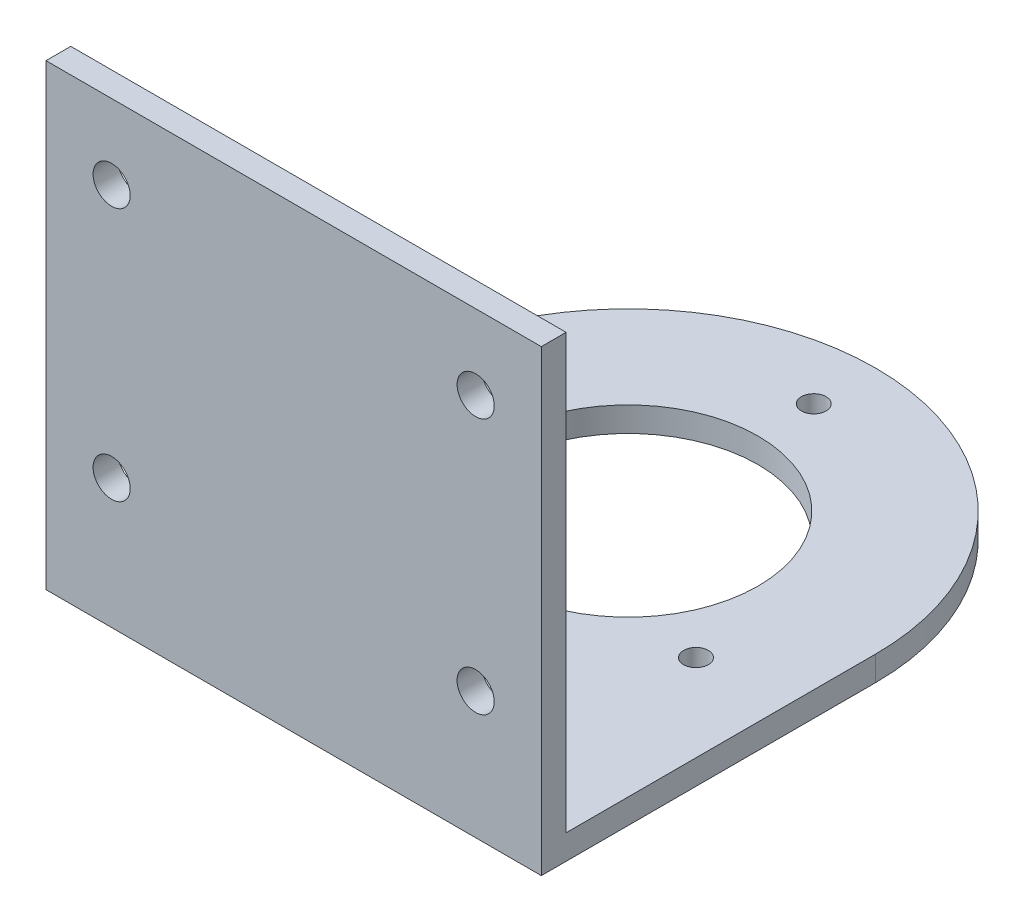
ISO-10303-21;
HEADER;
FILE_DESCRIPTION(('STEP AP214'),'2;1');
FILE_NAME('part.step','',(''),(''),'','','');
FILE_SCHEMA(('AUTOMOTIVE_DESIGN { 1 0 10303 214 1 1 1 1 }'));
ENDSEC;
DATA;
#1=APPLICATION_CONTEXT('core data for automotive mechanical design processes');
#2=APPLICATION_PROTOCOL_DEFINITION('international standard','automotive_design',2000,#1);
#3=PRODUCT_CONTEXT('',#1,'mechanical');
#4=PRODUCT('Part','Part','',(#3));
#5=PRODUCT_RELATED_PRODUCT_CATEGORY('part','',(#4));
#6=PRODUCT_DEFINITION_FORMATION('','',#4);
#7=PRODUCT_DEFINITION_CONTEXT('part definition',#1,'design');
#8=PRODUCT_DEFINITION('design','',#6,#7);
#9=PRODUCT_DEFINITION_SHAPE('','',#8);
#10=(LENGTH_UNIT() NAMED_UNIT(*) SI_UNIT(.MILLI.,.METRE.));
#11=(NAMED_UNIT(*) PLANE_ANGLE_UNIT() SI_UNIT($,.RADIAN.));
#12=(NAMED_UNIT(*) SI_UNIT($,.STERADIAN.) SOLID_ANGLE_UNIT());
#13=UNCERTAINTY_MEASURE_WITH_UNIT(LENGTH_MEASURE(1.E-05),#10,'distance_accuracy_value','');
#14=(GEOMETRIC_REPRESENTATION_CONTEXT(3) GLOBAL_UNCERTAINTY_ASSIGNED_CONTEXT((#13)) GLOBAL_UNIT_ASSIGNED_CONTEXT((#10,
#11,#12)) REPRESENTATION_CONTEXT('',''));
#15=CARTESIAN_POINT('',(0.,0.,0.));
#16=DIRECTION('',(0.,0.,1.));
#17=DIRECTION('',(1.,0.,0.));
#18=AXIS2_PLACEMENT_3D('',#15,#16,#17);
#19=CARTESIAN_POINT('',(1.77083333333332,2.,-5.43749999999999));
#20=DIRECTION('',(0.,1.,0.));
#21=DIRECTION('',(0.,0.,1.));
#22=AXIS2_PLACEMENT_3D('',#19,#20,#21);
#23=PLANE('',#22);
#24=CARTESIAN_POINT('',(14.7612143900999,2.,2.06250000000007));
#25=DIRECTION('',(0.,1.,0.));
#26=DIRECTION('',(-0.866025403784436,0.,-0.500000000000004));
#27=AXIS2_PLACEMENT_3D('',#24,#25,#26);
#28=CIRCLE('',#27,1.);
#29=CARTESIAN_POINT('',(13.8951889863154,2.,1.56250000000007));
#30=VERTEX_POINT('',#29);
#31=EDGE_CURVE('E121',#30,#30,#28,.T.);
#32=ORIENTED_EDGE('',*,*,#31,.F.);
#33=EDGE_LOOP('',(#32));
#34=FACE_BOUND('',#33,.T.);
#35=CARTESIAN_POINT('',(-11.2195477234333,2.,2.06249999999989));
#36=DIRECTION('',(0.,1.,0.));
#37=DIRECTION('',(0.866025403784443,0.,-0.499999999999992));
#38=AXIS2_PLACEMENT_3D('',#35,#36,#37);
#39=CIRCLE('',#38,1.);
#40=CARTESIAN_POINT('',(-10.3535223196489,2.,1.5624999999999));
#41=VERTEX_POINT('',#40);
#42=EDGE_CURVE('E126',#41,#41,#39,.T.);
#43=ORIENTED_EDGE('',*,*,#42,.F.);
#44=EDGE_LOOP('',(#43));
#45=FACE_BOUND('',#44,.T.);
#46=CARTESIAN_POINT('',(1.77083333333332,2.,-20.4375));
#47=DIRECTION('',(0.,1.,0.));
#48=DIRECTION('',(0.,0.,1.));
#49=AXIS2_PLACEMENT_3D('',#46,#47,#48);
#50=CIRCLE('',#49,1.);
#51=CARTESIAN_POINT('',(1.77083333333332,2.,-19.4375));
#52=VERTEX_POINT('',#51);
#53=EDGE_CURVE('E118',#52,#52,#50,.T.);
#54=ORIENTED_EDGE('',*,*,#53,.F.);
#55=EDGE_LOOP('',(#54));
#56=FACE_BOUND('',#55,.T.);
#57=DIRECTION('',(-1.,0.,0.));
#58=VECTOR('',#57,1.);
#59=CARTESIAN_POINT('',(-18.2291666666667,2.,19.5625));
#60=LINE('',#59,#58);
#61=CARTESIAN_POINT('',(21.7708333333333,2.,19.5625));
#62=VERTEX_POINT('',#61);
#63=CARTESIAN_POINT('',(-18.2291666666667,2.,19.5625));
#64=VERTEX_POINT('',#63);
#65=EDGE_CURVE('E56',#62,#64,#60,.T.);
#66=ORIENTED_EDGE('',*,*,#65,.F.);
#67=DIRECTION('',(0.,0.,-1.));
#68=VECTOR('',#67,1.);
#69=CARTESIAN_POINT('',(21.7708333333333,2.,-5.43749999999999));
#70=LINE('',#69,#68);
#71=CARTESIAN_POINT('',(21.7708333333333,2.,-5.43749999999999));
#72=VERTEX_POINT('',#71);
#73=EDGE_CURVE('E61',#62,#72,#70,.T.);
#74=ORIENTED_EDGE('',*,*,#73,.T.);
#75=CARTESIAN_POINT('',(1.77083333333332,2.,-5.43749999999999));
#76=DIRECTION('',(0.,1.,0.));
#77=DIRECTION('',(0.,0.,1.));
#78=AXIS2_PLACEMENT_3D('',#75,#76,#77);
#79=CIRCLE('',#78,20.);
#80=CARTESIAN_POINT('',(-18.2291666666667,2.,-5.43749999999999));
#81=VERTEX_POINT('',#80);
#82=EDGE_CURVE('E92',#72,#81,#79,.T.);
#83=ORIENTED_EDGE('',*,*,#82,.T.);
#84=DIRECTION('',(0.,0.,1.));
#85=VECTOR('',#84,1.);
#86=CARTESIAN_POINT('',(-18.2291666666667,2.,-5.43749999999999));
#87=LINE('',#86,#85);
#88=EDGE_CURVE('E159',#81,#64,#87,.T.);
#89=ORIENTED_EDGE('',*,*,#88,.T.);
#90=EDGE_LOOP('',(#66,#74,#83,#89));
#91=FACE_BOUND('',#90,.T.);
#92=CARTESIAN_POINT('',(1.77083333333332,2.,-5.43749999999999));
#93=DIRECTION('',(0.,1.,0.));
#94=DIRECTION('',(0.,0.,1.));
#95=AXIS2_PLACEMENT_3D('',#92,#93,#94);
#96=CIRCLE('',#95,10.5);
#97=CARTESIAN_POINT('',(1.77083333333332,2.,5.06250000000001));
#98=VERTEX_POINT('',#97);
#99=EDGE_CURVE('E103',#98,#98,#96,.T.);
#100=ORIENTED_EDGE('',*,*,#99,.F.);
#101=EDGE_LOOP('',(#100));
#102=FACE_BOUND('',#101,.T.);
#103=ADVANCED_FACE('F39',(#34,#45,#56,#91,#102),#23,.T.);
#104=CARTESIAN_POINT('',(1.77083333333332,0.,-5.43749999999999));
#105=DIRECTION('',(0.,1.,0.));
#106=DIRECTION('',(0.,0.,1.));
#107=AXIS2_PLACEMENT_3D('',#104,#105,#106);
#108=PLANE('',#107);
#109=CARTESIAN_POINT('',(14.7612143900999,0.,2.06250000000007));
#110=DIRECTION('',(0.,1.,0.));
#111=DIRECTION('',(0.,0.,1.));
#112=AXIS2_PLACEMENT_3D('',#109,#110,#111);
#113=CIRCLE('',#112,1.);
#114=CARTESIAN_POINT('',(14.7612143900999,0.,3.06250000000007));
#115=VERTEX_POINT('',#114);
#116=EDGE_CURVE('E43',#115,#115,#113,.T.);
#117=ORIENTED_EDGE('',*,*,#116,.T.);
#118=EDGE_LOOP('',(#117));
#119=FACE_BOUND('',#118,.T.);
#120=CARTESIAN_POINT('',(-11.2195477234333,0.,2.06249999999989));
#121=DIRECTION('',(0.,1.,0.));
#122=DIRECTION('',(0.,0.,1.));
#123=AXIS2_PLACEMENT_3D('',#120,#121,#122);
#124=CIRCLE('',#123,1.);
#125=CARTESIAN_POINT('',(-11.2195477234333,0.,3.06249999999989));
#126=VERTEX_POINT('',#125);
#127=EDGE_CURVE('E119',#126,#126,#124,.T.);
#128=ORIENTED_EDGE('',*,*,#127,.T.);
#129=EDGE_LOOP('',(#128));
#130=FACE_BOUND('',#129,.T.);
#131=CARTESIAN_POINT('',(1.77083333333332,0.,-20.4375));
#132=DIRECTION('',(0.,1.,0.));
#133=DIRECTION('',(0.,0.,1.));
#134=AXIS2_PLACEMENT_3D('',#131,#132,#133);
#135=CIRCLE('',#134,1.);
#136=CARTESIAN_POINT('',(1.77083333333332,0.,-19.4375));
#137=VERTEX_POINT('',#136);
#138=EDGE_CURVE('E116',#137,#137,#135,.T.);
#139=ORIENTED_EDGE('',*,*,#138,.T.);
#140=EDGE_LOOP('',(#139));
#141=FACE_BOUND('',#140,.T.);
#142=CARTESIAN_POINT('',(1.77083333333332,0.,-5.43749999999999));
#143=DIRECTION('',(0.,1.,0.));
#144=DIRECTION('',(0.,0.,1.));
#145=AXIS2_PLACEMENT_3D('',#142,#143,#144);
#146=CIRCLE('',#145,20.);
#147=CARTESIAN_POINT('',(21.7708333333333,0.,-5.43749999999999));
#148=VERTEX_POINT('',#147);
#149=CARTESIAN_POINT('',(-18.2291666666667,0.,-5.43749999999999));
#150=VERTEX_POINT('',#149);
#151=EDGE_CURVE('E98',#148,#150,#146,.T.);
#152=ORIENTED_EDGE('',*,*,#151,.F.);
#153=DIRECTION('',(0.,0.,-1.));
#154=VECTOR('',#153,1.);
#155=CARTESIAN_POINT('',(21.7708333333333,0.,-5.43749999999999));
#156=LINE('',#155,#154);
#157=CARTESIAN_POINT('',(21.7708333333333,0.,21.5625));
#158=VERTEX_POINT('',#157);
#159=EDGE_CURVE('E81',#158,#148,#156,.T.);
#160=ORIENTED_EDGE('',*,*,#159,.F.);
#161=DIRECTION('',(1.,0.,0.));
#162=VECTOR('',#161,1.);
#163=CARTESIAN_POINT('',(-18.2291666666667,0.,21.5625));
#164=LINE('',#163,#162);
#165=CARTESIAN_POINT('',(-18.2291666666667,0.,21.5625));
#166=VERTEX_POINT('',#165);
#167=EDGE_CURVE('E93',#166,#158,#164,.T.);
#168=ORIENTED_EDGE('',*,*,#167,.F.);
#169=DIRECTION('',(0.,0.,1.));
#170=VECTOR('',#169,1.);
#171=CARTESIAN_POINT('',(-18.2291666666667,0.,-5.43749999999999));
#172=LINE('',#171,#170);
#173=EDGE_CURVE('E102',#150,#166,#172,.T.);
#174=ORIENTED_EDGE('',*,*,#173,.F.);
#175=EDGE_LOOP('',(#152,#160,#168,#174));
#176=FACE_BOUND('',#175,.T.);
#177=CARTESIAN_POINT('',(1.77083333333332,0.,-5.43749999999999));
#178=DIRECTION('',(0.,1.,0.));
#179=DIRECTION('',(0.,0.,1.));
#180=AXIS2_PLACEMENT_3D('',#177,#178,#179);
#181=CIRCLE('',#180,10.5);
#182=CARTESIAN_POINT('',(1.77083333333332,0.,5.06250000000001));
#183=VERTEX_POINT('',#182);
#184=EDGE_CURVE('E107',#183,#183,#181,.T.);
#185=ORIENTED_EDGE('',*,*,#184,.T.);
#186=EDGE_LOOP('',(#185));
#187=FACE_BOUND('',#186,.T.);
#188=ADVANCED_FACE('F100',(#119,#130,#141,#176,#187),#108,.F.);
#189=CARTESIAN_POINT('',(1.77083333333332,2.,-5.43749999999999));
#190=DIRECTION('',(0.,-1.,0.));
#191=DIRECTION('',(0.,0.,-1.));
#192=AXIS2_PLACEMENT_3D('',#189,#190,#191);
#193=CYLINDRICAL_SURFACE('',#192,20.);
#194=ORIENTED_EDGE('',*,*,#151,.T.);
#195=DIRECTION('',(0.,-1.,0.));
#196=VECTOR('',#195,1.);
#197=CARTESIAN_POINT('',(-18.2291666666667,2.,-5.43749999999999));
#198=LINE('',#197,#196);
#199=EDGE_CURVE('E11',#81,#150,#198,.T.);
#200=ORIENTED_EDGE('',*,*,#199,.F.);
#201=ORIENTED_EDGE('',*,*,#82,.F.);
#202=DIRECTION('',(0.,-1.,0.));
#203=VECTOR('',#202,1.);
#204=CARTESIAN_POINT('',(21.7708333333333,2.,-5.43749999999999));
#205=LINE('',#204,#203);
#206=EDGE_CURVE('E84',#72,#148,#205,.T.);
#207=ORIENTED_EDGE('',*,*,#206,.T.);
#208=EDGE_LOOP('',(#194,#200,#201,#207));
#209=FACE_BOUND('',#208,.T.);
#210=ADVANCED_FACE('F41',(#209),#193,.T.);
#211=CARTESIAN_POINT('',(-18.2291666666667,2.,-5.43749999999999));
#212=DIRECTION('',(1.,0.,0.));
#213=DIRECTION('',(0.,0.,-1.));
#214=AXIS2_PLACEMENT_3D('',#211,#212,#213);
#215=PLANE('',#214);
#216=ORIENTED_EDGE('',*,*,#173,.T.);
#217=DIRECTION('',(0.,-1.,0.));
#218=VECTOR('',#217,1.);
#219=CARTESIAN_POINT('',(-18.2291666666667,2.,21.5625));
#220=LINE('',#219,#218);
#221=CARTESIAN_POINT('',(-18.2291666666667,37.,21.5625));
#222=VERTEX_POINT('',#221);
#223=EDGE_CURVE('E48',#222,#166,#220,.T.);
#224=ORIENTED_EDGE('',*,*,#223,.F.);
#225=DIRECTION('',(0.,0.,1.));
#226=VECTOR('',#225,1.);
#227=CARTESIAN_POINT('',(-18.2291666666667,37.,21.5625));
#228=LINE('',#227,#226);
#229=CARTESIAN_POINT('',(-18.2291666666667,37.,19.5625));
#230=VERTEX_POINT('',#229);
#231=EDGE_CURVE('E138',#230,#222,#228,.T.);
#232=ORIENTED_EDGE('',*,*,#231,.F.);
#233=DIRECTION('',(0.,-1.,0.));
#234=VECTOR('',#233,1.);
#235=CARTESIAN_POINT('',(-18.2291666666667,37.,19.5625));
#236=LINE('',#235,#234);
#237=EDGE_CURVE('E150',#230,#64,#236,.T.);
#238=ORIENTED_EDGE('',*,*,#237,.T.);
#239=ORIENTED_EDGE('',*,*,#88,.F.);
#240=ORIENTED_EDGE('',*,*,#199,.T.);
#241=EDGE_LOOP('',(#216,#224,#232,#238,#239,#240));
#242=FACE_BOUND('',#241,.T.);
#243=ADVANCED_FACE('F170',(#242),#215,.F.);
#244=CARTESIAN_POINT('',(-18.2291666666667,2.,21.5625));
#245=DIRECTION('',(0.,0.,-1.));
#246=DIRECTION('',(-1.,0.,0.));
#247=AXIS2_PLACEMENT_3D('',#244,#245,#246);
#248=PLANE('',#247);
#249=CARTESIAN_POINT('',(-12.9291666666667,30.9641670200774,21.5625));
#250=DIRECTION('',(0.,0.,-1.));
#251=DIRECTION('',(-1.,0.,0.));
#252=AXIS2_PLACEMENT_3D('',#249,#250,#251);
#253=CIRCLE('',#252,1.5);
#254=CARTESIAN_POINT('',(-14.4291666666667,30.9641670200774,21.5625));
#255=VERTEX_POINT('',#254);
#256=EDGE_CURVE('E245',#255,#255,#253,.T.);
#257=ORIENTED_EDGE('',*,*,#256,.T.);
#258=EDGE_LOOP('',(#257));
#259=FACE_BOUND('',#258,.T.);
#260=CARTESIAN_POINT('',(-12.9291666666667,10.4708516025523,21.5625));
#261=DIRECTION('',(0.,0.,-1.));
#262=DIRECTION('',(-1.,0.,0.));
#263=AXIS2_PLACEMENT_3D('',#260,#261,#262);
#264=CIRCLE('',#263,1.5);
#265=CARTESIAN_POINT('',(-14.4291666666667,10.4708516025523,21.5625));
#266=VERTEX_POINT('',#265);
#267=EDGE_CURVE('E247',#266,#266,#264,.T.);
#268=ORIENTED_EDGE('',*,*,#267,.T.);
#269=EDGE_LOOP('',(#268));
#270=FACE_BOUND('',#269,.T.);
#271=CARTESIAN_POINT('',(16.4668883487892,10.2623719123833,21.5625));
#272=DIRECTION('',(0.,0.,-1.));
#273=DIRECTION('',(-1.,0.,0.));
#274=AXIS2_PLACEMENT_3D('',#271,#272,#273);
#275=CIRCLE('',#274,1.5);
#276=CARTESIAN_POINT('',(14.9668883487892,10.2623719123833,21.5625));
#277=VERTEX_POINT('',#276);
#278=EDGE_CURVE('E131',#277,#277,#275,.T.);
#279=ORIENTED_EDGE('',*,*,#278,.T.);
#280=EDGE_LOOP('',(#279));
#281=FACE_BOUND('',#280,.T.);
#282=CARTESIAN_POINT('',(16.4708333333333,30.9524700707891,21.5625));
#283=DIRECTION('',(0.,0.,-1.));
#284=DIRECTION('',(-1.,0.,0.));
#285=AXIS2_PLACEMENT_3D('',#282,#283,#284);
#286=CIRCLE('',#285,1.5);
#287=CARTESIAN_POINT('',(14.9708333333333,30.9524700707891,21.5625));
#288=VERTEX_POINT('',#287);
#289=EDGE_CURVE('E257',#288,#288,#286,.T.);
#290=ORIENTED_EDGE('',*,*,#289,.T.);
#291=EDGE_LOOP('',(#290));
#292=FACE_BOUND('',#291,.T.);
#293=ORIENTED_EDGE('',*,*,#167,.T.);
#294=DIRECTION('',(0.,-1.,0.));
#295=VECTOR('',#294,1.);
#296=CARTESIAN_POINT('',(21.7708333333333,2.,21.5625));
#297=LINE('',#296,#295);
#298=CARTESIAN_POINT('',(21.7708333333333,37.,21.5625));
#299=VERTEX_POINT('',#298);
#300=EDGE_CURVE('E88',#299,#158,#297,.T.);
#301=ORIENTED_EDGE('',*,*,#300,.F.);
#302=DIRECTION('',(1.,0.,0.));
#303=VECTOR('',#302,1.);
#304=CARTESIAN_POINT('',(-18.2291666666667,37.,21.5625));
#305=LINE('',#304,#303);
#306=EDGE_CURVE('E141',#222,#299,#305,.T.);
#307=ORIENTED_EDGE('',*,*,#306,.F.);
#308=ORIENTED_EDGE('',*,*,#223,.T.);
#309=EDGE_LOOP('',(#293,#301,#307,#308));
#310=FACE_BOUND('',#309,.T.);
#311=ADVANCED_FACE('F182',(#259,#270,#281,#292,#310),#248,.F.);
#312=CARTESIAN_POINT('',(21.7708333333333,2.,-5.43749999999999));
#313=DIRECTION('',(-1.,0.,0.));
#314=DIRECTION('',(0.,0.,1.));
#315=AXIS2_PLACEMENT_3D('',#312,#313,#314);
#316=PLANE('',#315);
#317=ORIENTED_EDGE('',*,*,#159,.T.);
#318=ORIENTED_EDGE('',*,*,#206,.F.);
#319=ORIENTED_EDGE('',*,*,#73,.F.);
#320=DIRECTION('',(0.,-1.,0.));
#321=VECTOR('',#320,1.);
#322=CARTESIAN_POINT('',(21.7708333333333,37.,19.5625));
#323=LINE('',#322,#321);
#324=CARTESIAN_POINT('',(21.7708333333333,37.,19.5625));
#325=VERTEX_POINT('',#324);
#326=EDGE_CURVE('E154',#325,#62,#323,.T.);
#327=ORIENTED_EDGE('',*,*,#326,.F.);
#328=DIRECTION('',(0.,0.,-1.));
#329=VECTOR('',#328,1.);
#330=CARTESIAN_POINT('',(21.7708333333333,37.,21.5625));
#331=LINE('',#330,#329);
#332=EDGE_CURVE('E144',#299,#325,#331,.T.);
#333=ORIENTED_EDGE('',*,*,#332,.F.);
#334=ORIENTED_EDGE('',*,*,#300,.T.);
#335=EDGE_LOOP('',(#317,#318,#319,#327,#333,#334));
#336=FACE_BOUND('',#335,.T.);
#337=ADVANCED_FACE('F83',(#336),#316,.F.);
#338=CARTESIAN_POINT('',(1.77083333333332,2.,-5.43749999999999));
#339=DIRECTION('',(0.,-1.,0.));
#340=DIRECTION('',(0.,0.,-1.));
#341=AXIS2_PLACEMENT_3D('',#338,#339,#340);
#342=CYLINDRICAL_SURFACE('',#341,10.5);
#343=ORIENTED_EDGE('',*,*,#99,.T.);
#344=EDGE_LOOP('',(#343));
#345=FACE_BOUND('',#344,.T.);
#346=ORIENTED_EDGE('',*,*,#184,.F.);
#347=EDGE_LOOP('',(#346));
#348=FACE_BOUND('',#347,.T.);
#349=ADVANCED_FACE('F190',(#345,#348),#342,.F.);
#350=CARTESIAN_POINT('',(-18.2291666666667,37.,19.5625));
#351=DIRECTION('',(0.,0.,1.));
#352=DIRECTION('',(1.,0.,0.));
#353=AXIS2_PLACEMENT_3D('',#350,#351,#352);
#354=PLANE('',#353);
#355=CARTESIAN_POINT('',(-12.9291666666667,30.9641670200774,19.5625));
#356=DIRECTION('',(0.,0.,-1.));
#357=DIRECTION('',(-1.,0.,0.));
#358=AXIS2_PLACEMENT_3D('',#355,#356,#357);
#359=CIRCLE('',#358,1.5);
#360=CARTESIAN_POINT('',(-14.4291666666667,30.9641670200774,19.5625));
#361=VERTEX_POINT('',#360);
#362=EDGE_CURVE('E243',#361,#361,#359,.T.);
#363=ORIENTED_EDGE('',*,*,#362,.F.);
#364=EDGE_LOOP('',(#363));
#365=FACE_BOUND('',#364,.T.);
#366=CARTESIAN_POINT('',(-12.9291666666667,10.4708516025523,19.5625));
#367=DIRECTION('',(0.,0.,-1.));
#368=DIRECTION('',(-1.,0.,0.));
#369=AXIS2_PLACEMENT_3D('',#366,#367,#368);
#370=CIRCLE('',#369,1.5);
#371=CARTESIAN_POINT('',(-14.4291666666667,10.4708516025523,19.5625));
#372=VERTEX_POINT('',#371);
#373=EDGE_CURVE('E270',#372,#372,#370,.T.);
#374=ORIENTED_EDGE('',*,*,#373,.F.);
#375=EDGE_LOOP('',(#374));
#376=FACE_BOUND('',#375,.T.);
#377=CARTESIAN_POINT('',(16.4668883487892,10.2623719123833,19.5625));
#378=DIRECTION('',(0.,0.,-1.));
#379=DIRECTION('',(-1.,0.,0.));
#380=AXIS2_PLACEMENT_3D('',#377,#378,#379);
#381=CIRCLE('',#380,1.5);
#382=CARTESIAN_POINT('',(14.9668883487892,10.2623719123833,19.5625));
#383=VERTEX_POINT('',#382);
#384=EDGE_CURVE('E250',#383,#383,#381,.T.);
#385=ORIENTED_EDGE('',*,*,#384,.F.);
#386=EDGE_LOOP('',(#385));
#387=FACE_BOUND('',#386,.T.);
#388=CARTESIAN_POINT('',(16.4708333333333,30.9524700707891,19.5625));
#389=DIRECTION('',(0.,0.,-1.));
#390=DIRECTION('',(-1.,0.,0.));
#391=AXIS2_PLACEMENT_3D('',#388,#389,#390);
#392=CIRCLE('',#391,1.5);
#393=CARTESIAN_POINT('',(14.9708333333333,30.9524700707891,19.5625));
#394=VERTEX_POINT('',#393);
#395=EDGE_CURVE('E246',#394,#394,#392,.T.);
#396=ORIENTED_EDGE('',*,*,#395,.F.);
#397=EDGE_LOOP('',(#396));
#398=FACE_BOUND('',#397,.T.);
#399=ORIENTED_EDGE('',*,*,#65,.T.);
#400=ORIENTED_EDGE('',*,*,#237,.F.);
#401=DIRECTION('',(-1.,0.,0.));
#402=VECTOR('',#401,1.);
#403=CARTESIAN_POINT('',(-18.2291666666667,37.,19.5625));
#404=LINE('',#403,#402);
#405=EDGE_CURVE('E147',#325,#230,#404,.T.);
#406=ORIENTED_EDGE('',*,*,#405,.F.);
#407=ORIENTED_EDGE('',*,*,#326,.T.);
#408=EDGE_LOOP('',(#399,#400,#406,#407));
#409=FACE_BOUND('',#408,.T.);
#410=ADVANCED_FACE('F166',(#365,#376,#387,#398,#409),#354,.F.);
#411=CARTESIAN_POINT('',(0.,37.,0.));
#412=DIRECTION('',(0.,-1.,0.));
#413=DIRECTION('',(0.,0.,-1.));
#414=AXIS2_PLACEMENT_3D('',#411,#412,#413);
#415=PLANE('',#414);
#416=ORIENTED_EDGE('',*,*,#231,.T.);
#417=ORIENTED_EDGE('',*,*,#306,.T.);
#418=ORIENTED_EDGE('',*,*,#332,.T.);
#419=ORIENTED_EDGE('',*,*,#405,.T.);
#420=EDGE_LOOP('',(#416,#417,#418,#419));
#421=FACE_BOUND('',#420,.T.);
#422=ADVANCED_FACE('F176',(#421),#415,.F.);
#423=CARTESIAN_POINT('',(1.77083333333332,-33.,-20.4375));
#424=DIRECTION('',(0.,1.,0.));
#425=DIRECTION('',(0.,0.,1.));
#426=AXIS2_PLACEMENT_3D('',#423,#424,#425);
#427=CYLINDRICAL_SURFACE('',#426,1.);
#428=ORIENTED_EDGE('',*,*,#53,.T.);
#429=EDGE_LOOP('',(#428));
#430=FACE_BOUND('',#429,.T.);
#431=ORIENTED_EDGE('',*,*,#138,.F.);
#432=EDGE_LOOP('',(#431));
#433=FACE_BOUND('',#432,.T.);
#434=ADVANCED_FACE('F212',(#430,#433),#427,.F.);
#435=CARTESIAN_POINT('',(-11.2195477234333,-33.,2.06249999999989));
#436=DIRECTION('',(0.,1.,0.));
#437=DIRECTION('',(0.,0.,1.));
#438=AXIS2_PLACEMENT_3D('',#435,#436,#437);
#439=CYLINDRICAL_SURFACE('',#438,1.);
#440=ORIENTED_EDGE('',*,*,#42,.T.);
#441=EDGE_LOOP('',(#440));
#442=FACE_BOUND('',#441,.T.);
#443=ORIENTED_EDGE('',*,*,#127,.F.);
#444=EDGE_LOOP('',(#443));
#445=FACE_BOUND('',#444,.T.);
#446=ADVANCED_FACE('F215',(#442,#445),#439,.F.);
#447=CARTESIAN_POINT('',(14.7612143900999,-33.,2.06250000000007));
#448=DIRECTION('',(0.,1.,0.));
#449=DIRECTION('',(0.,0.,1.));
#450=AXIS2_PLACEMENT_3D('',#447,#448,#449);
#451=CYLINDRICAL_SURFACE('',#450,1.);
#452=ORIENTED_EDGE('',*,*,#31,.T.);
#453=EDGE_LOOP('',(#452));
#454=FACE_BOUND('',#453,.T.);
#455=ORIENTED_EDGE('',*,*,#116,.F.);
#456=EDGE_LOOP('',(#455));
#457=FACE_BOUND('',#456,.T.);
#458=ADVANCED_FACE('F219',(#454,#457),#451,.F.);
#459=CARTESIAN_POINT('',(16.4708333333333,30.9524700707891,54.5625));
#460=DIRECTION('',(0.,0.,-1.));
#461=DIRECTION('',(-1.,0.,0.));
#462=AXIS2_PLACEMENT_3D('',#459,#460,#461);
#463=CYLINDRICAL_SURFACE('',#462,1.5);
#464=ORIENTED_EDGE('',*,*,#395,.T.);
#465=EDGE_LOOP('',(#464));
#466=FACE_BOUND('',#465,.T.);
#467=ORIENTED_EDGE('',*,*,#289,.F.);
#468=EDGE_LOOP('',(#467));
#469=FACE_BOUND('',#468,.T.);
#470=ADVANCED_FACE('F223',(#466,#469),#463,.F.);
#471=CARTESIAN_POINT('',(16.4668883487892,10.2623719123833,54.5625));
#472=DIRECTION('',(0.,0.,-1.));
#473=DIRECTION('',(-1.,0.,0.));
#474=AXIS2_PLACEMENT_3D('',#471,#472,#473);
#475=CYLINDRICAL_SURFACE('',#474,1.5);
#476=ORIENTED_EDGE('',*,*,#384,.T.);
#477=EDGE_LOOP('',(#476));
#478=FACE_BOUND('',#477,.T.);
#479=ORIENTED_EDGE('',*,*,#278,.F.);
#480=EDGE_LOOP('',(#479));
#481=FACE_BOUND('',#480,.T.);
#482=ADVANCED_FACE('F226',(#478,#481),#475,.F.);
#483=CARTESIAN_POINT('',(-12.9291666666667,10.4708516025523,54.5625));
#484=DIRECTION('',(0.,0.,-1.));
#485=DIRECTION('',(-1.,0.,0.));
#486=AXIS2_PLACEMENT_3D('',#483,#484,#485);
#487=CYLINDRICAL_SURFACE('',#486,1.5);
#488=ORIENTED_EDGE('',*,*,#373,.T.);
#489=EDGE_LOOP('',(#488));
#490=FACE_BOUND('',#489,.T.);
#491=ORIENTED_EDGE('',*,*,#267,.F.);
#492=EDGE_LOOP('',(#491));
#493=FACE_BOUND('',#492,.T.);
#494=ADVANCED_FACE('F230',(#490,#493),#487,.F.);
#495=CARTESIAN_POINT('',(-12.9291666666667,30.9641670200774,54.5625));
#496=DIRECTION('',(0.,0.,-1.));
#497=DIRECTION('',(-1.,0.,0.));
#498=AXIS2_PLACEMENT_3D('',#495,#496,#497);
#499=CYLINDRICAL_SURFACE('',#498,1.5);
#500=ORIENTED_EDGE('',*,*,#362,.T.);
#501=EDGE_LOOP('',(#500));
#502=FACE_BOUND('',#501,.T.);
#503=ORIENTED_EDGE('',*,*,#256,.F.);
#504=EDGE_LOOP('',(#503));
#505=FACE_BOUND('',#504,.T.);
#506=ADVANCED_FACE('F234',(#502,#505),#499,.F.);
#507=CLOSED_SHELL('',(#103,#188,#210,#243,#311,#337,#349,#410,#422,#434,#446,#458,#470,#482,
#494,#506));
#508=MANIFOLD_SOLID_BREP('B2',#507);
#509=ADVANCED_BREP_SHAPE_REPRESENTATION('',(#18,#508),#14);
#510=SHAPE_DEFINITION_REPRESENTATION(#9,#509);
ENDSEC;
END-ISO-10303-21;
